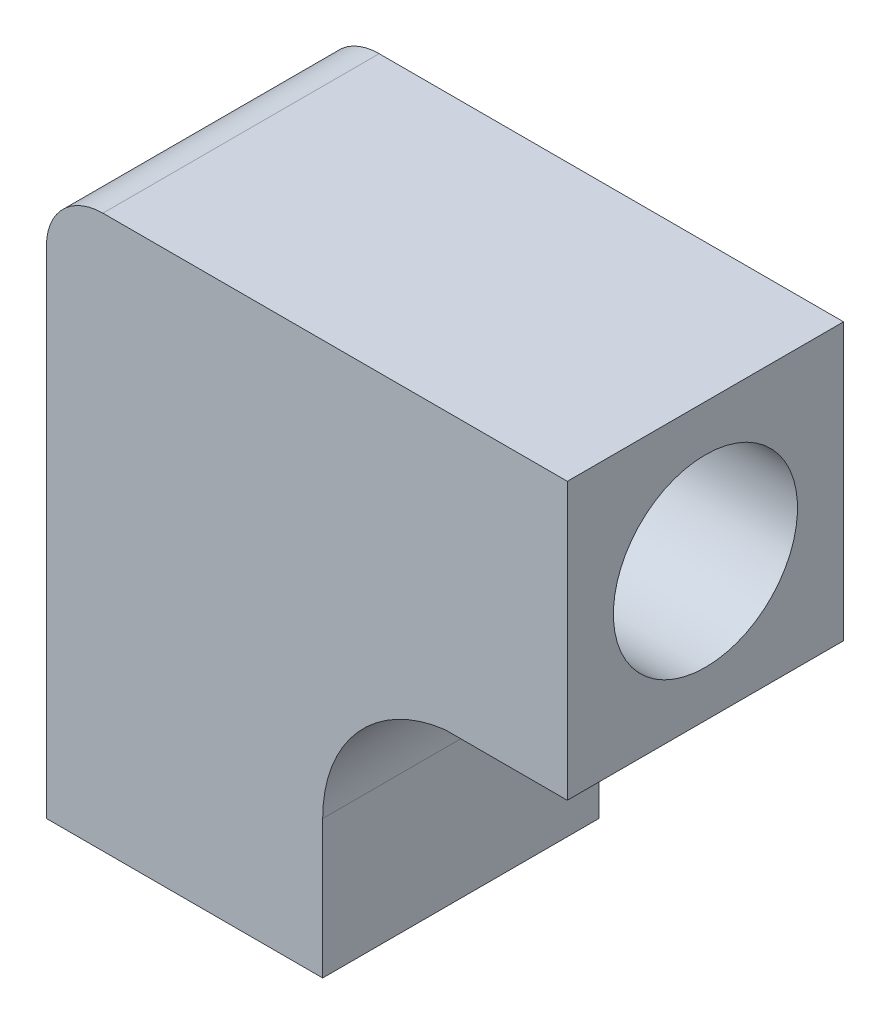
ISO-10303-21;
HEADER;
FILE_DESCRIPTION(('STEP AP214'),'2;1');
FILE_NAME('part.step','',(''),(''),'','','');
FILE_SCHEMA(('AUTOMOTIVE_DESIGN { 1 0 10303 214 1 1 1 1 }'));
ENDSEC;
DATA;
#1=APPLICATION_CONTEXT('core data for automotive mechanical design processes');
#2=APPLICATION_PROTOCOL_DEFINITION('international standard','automotive_design',2000,#1);
#3=PRODUCT_CONTEXT('',#1,'mechanical');
#4=PRODUCT('Part','Part','',(#3));
#5=PRODUCT_RELATED_PRODUCT_CATEGORY('part','',(#4));
#6=PRODUCT_DEFINITION_FORMATION('','',#4);
#7=PRODUCT_DEFINITION_CONTEXT('part definition',#1,'design');
#8=PRODUCT_DEFINITION('design','',#6,#7);
#9=PRODUCT_DEFINITION_SHAPE('','',#8);
#10=(LENGTH_UNIT() NAMED_UNIT(*) SI_UNIT(.MILLI.,.METRE.));
#11=(NAMED_UNIT(*) PLANE_ANGLE_UNIT() SI_UNIT($,.RADIAN.));
#12=(NAMED_UNIT(*) SI_UNIT($,.STERADIAN.) SOLID_ANGLE_UNIT());
#13=UNCERTAINTY_MEASURE_WITH_UNIT(LENGTH_MEASURE(1.E-05),#10,'distance_accuracy_value','');
#14=(GEOMETRIC_REPRESENTATION_CONTEXT(3) GLOBAL_UNCERTAINTY_ASSIGNED_CONTEXT((#13)) GLOBAL_UNIT_ASSIGNED_CONTEXT((#10,
#11,#12)) REPRESENTATION_CONTEXT('',''));
#15=CARTESIAN_POINT('',(0.,0.,0.));
#16=DIRECTION('',(0.,0.,1.));
#17=DIRECTION('',(1.,0.,0.));
#18=AXIS2_PLACEMENT_3D('',#15,#16,#17);
#19=CARTESIAN_POINT('',(0.,12.,6.));
#20=DIRECTION('',(0.,1.,0.));
#21=DIRECTION('',(0.,0.,1.));
#22=AXIS2_PLACEMENT_3D('',#19,#20,#21);
#23=PLANE('',#22);
#24=DIRECTION('',(1.,0.,0.));
#25=VECTOR('',#24,1.);
#26=CARTESIAN_POINT('',(0.,12.,0.));
#27=LINE('',#26,#25);
#28=CARTESIAN_POINT('',(-4.77317247755238,12.,0.));
#29=VERTEX_POINT('',#28);
#30=CARTESIAN_POINT('',(5.31378299120235,12.,0.));
#31=VERTEX_POINT('',#30);
#32=EDGE_CURVE('E130',#29,#31,#27,.T.);
#33=ORIENTED_EDGE('',*,*,#32,.F.);
#34=DIRECTION('',(0.,0.,-1.));
#35=VECTOR('',#34,1.);
#36=CARTESIAN_POINT('',(-4.77317247755238,12.,6.));
#37=LINE('',#36,#35);
#38=CARTESIAN_POINT('',(-4.77317247755238,12.,6.));
#39=VERTEX_POINT('',#38);
#40=EDGE_CURVE('E11',#39,#29,#37,.T.);
#41=ORIENTED_EDGE('',*,*,#40,.F.);
#42=DIRECTION('',(1.,0.,0.));
#43=VECTOR('',#42,1.);
#44=CARTESIAN_POINT('',(0.,12.,6.));
#45=LINE('',#44,#43);
#46=CARTESIAN_POINT('',(5.31378299120235,12.,6.));
#47=VERTEX_POINT('',#46);
#48=EDGE_CURVE('E151',#39,#47,#45,.T.);
#49=ORIENTED_EDGE('',*,*,#48,.T.);
#50=DIRECTION('',(0.,0.,-1.));
#51=VECTOR('',#50,1.);
#52=CARTESIAN_POINT('',(5.31378299120235,12.,6.));
#53=LINE('',#52,#51);
#54=EDGE_CURVE('E52',#47,#31,#53,.T.);
#55=ORIENTED_EDGE('',*,*,#54,.T.);
#56=EDGE_LOOP('',(#33,#41,#49,#55));
#57=FACE_BOUND('',#56,.T.);
#58=ADVANCED_FACE('F36',(#57),#23,.T.);
#59=CARTESIAN_POINT('',(-4.77317247755238,10.7731724775524,6.));
#60=DIRECTION('',(0.,0.,-1.));
#61=DIRECTION('',(-1.,0.,0.));
#62=AXIS2_PLACEMENT_3D('',#59,#60,#61);
#63=CYLINDRICAL_SURFACE('',#62,1.22682752244762);
#64=CARTESIAN_POINT('',(-4.77317247755238,10.7731724775524,0.));
#65=DIRECTION('',(0.,0.,1.));
#66=DIRECTION('',(1.,0.,0.));
#67=AXIS2_PLACEMENT_3D('',#64,#65,#66);
#68=CIRCLE('',#67,1.22682752244762);
#69=CARTESIAN_POINT('',(-6.,10.7731724775524,0.));
#70=VERTEX_POINT('',#69);
#71=EDGE_CURVE('E132',#29,#70,#68,.T.);
#72=ORIENTED_EDGE('',*,*,#71,.T.);
#73=DIRECTION('',(0.,0.,-1.));
#74=VECTOR('',#73,1.);
#75=CARTESIAN_POINT('',(-6.,10.7731724775524,6.));
#76=LINE('',#75,#74);
#77=CARTESIAN_POINT('',(-6.,10.7731724775524,6.));
#78=VERTEX_POINT('',#77);
#79=EDGE_CURVE('E44',#78,#70,#76,.T.);
#80=ORIENTED_EDGE('',*,*,#79,.F.);
#81=CARTESIAN_POINT('',(-4.77317247755238,10.7731724775524,6.));
#82=DIRECTION('',(0.,0.,1.));
#83=DIRECTION('',(1.,0.,0.));
#84=AXIS2_PLACEMENT_3D('',#81,#82,#83);
#85=CIRCLE('',#84,1.22682752244762);
#86=EDGE_CURVE('E176',#39,#78,#85,.T.);
#87=ORIENTED_EDGE('',*,*,#86,.F.);
#88=ORIENTED_EDGE('',*,*,#40,.T.);
#89=EDGE_LOOP('',(#72,#80,#87,#88));
#90=FACE_BOUND('',#89,.T.);
#91=ADVANCED_FACE('F167',(#90),#63,.T.);
#92=CARTESIAN_POINT('',(-6.,0.,6.));
#93=DIRECTION('',(-1.,0.,0.));
#94=DIRECTION('',(0.,0.,1.));
#95=AXIS2_PLACEMENT_3D('',#92,#93,#94);
#96=PLANE('',#95);
#97=DIRECTION('',(0.,1.,0.));
#98=VECTOR('',#97,1.);
#99=CARTESIAN_POINT('',(-6.,0.,0.));
#100=LINE('',#99,#98);
#101=CARTESIAN_POINT('',(-6.,0.,0.));
#102=VERTEX_POINT('',#101);
#103=EDGE_CURVE('E136',#102,#70,#100,.T.);
#104=ORIENTED_EDGE('',*,*,#103,.F.);
#105=DIRECTION('',(0.,0.,-1.));
#106=VECTOR('',#105,1.);
#107=CARTESIAN_POINT('',(-6.,0.,6.));
#108=LINE('',#107,#106);
#109=CARTESIAN_POINT('',(-6.,0.,6.));
#110=VERTEX_POINT('',#109);
#111=EDGE_CURVE('E157',#110,#102,#108,.T.);
#112=ORIENTED_EDGE('',*,*,#111,.F.);
#113=DIRECTION('',(0.,1.,0.));
#114=VECTOR('',#113,1.);
#115=CARTESIAN_POINT('',(-6.,0.,6.));
#116=LINE('',#115,#114);
#117=EDGE_CURVE('E164',#110,#78,#116,.T.);
#118=ORIENTED_EDGE('',*,*,#117,.T.);
#119=ORIENTED_EDGE('',*,*,#79,.T.);
#120=EDGE_LOOP('',(#104,#112,#118,#119));
#121=FACE_BOUND('',#120,.T.);
#122=ADVANCED_FACE('F162',(#121),#96,.T.);
#123=CARTESIAN_POINT('',(0.,0.,6.));
#124=DIRECTION('',(0.,-1.,0.));
#125=DIRECTION('',(1.,0.,0.));
#126=AXIS2_PLACEMENT_3D('',#123,#124,#125);
#127=PLANE('',#126);
#128=CARTESIAN_POINT('',(-3.,0.,3.));
#129=DIRECTION('',(0.,-1.,0.));
#130=DIRECTION('',(1.,0.,0.));
#131=AXIS2_PLACEMENT_3D('',#128,#129,#130);
#132=CIRCLE('',#131,2.);
#133=CARTESIAN_POINT('',(-1.,0.,3.));
#134=VERTEX_POINT('',#133);
#135=EDGE_CURVE('E297',#134,#134,#132,.T.);
#136=ORIENTED_EDGE('',*,*,#135,.F.);
#137=EDGE_LOOP('',(#136));
#138=FACE_BOUND('',#137,.T.);
#139=DIRECTION('',(-1.,0.,0.));
#140=VECTOR('',#139,1.);
#141=CARTESIAN_POINT('',(0.,0.,0.));
#142=LINE('',#141,#140);
#143=CARTESIAN_POINT('',(0.,0.,0.));
#144=VERTEX_POINT('',#143);
#145=EDGE_CURVE('E139',#144,#102,#142,.T.);
#146=ORIENTED_EDGE('',*,*,#145,.F.);
#147=DIRECTION('',(0.,0.,-1.));
#148=VECTOR('',#147,1.);
#149=CARTESIAN_POINT('',(0.,0.,6.));
#150=LINE('',#149,#148);
#151=CARTESIAN_POINT('',(0.,0.,6.));
#152=VERTEX_POINT('',#151);
#153=EDGE_CURVE('E155',#152,#144,#150,.T.);
#154=ORIENTED_EDGE('',*,*,#153,.F.);
#155=DIRECTION('',(-1.,0.,0.));
#156=VECTOR('',#155,1.);
#157=CARTESIAN_POINT('',(0.,0.,6.));
#158=LINE('',#157,#156);
#159=EDGE_CURVE('E175',#152,#110,#158,.T.);
#160=ORIENTED_EDGE('',*,*,#159,.T.);
#161=ORIENTED_EDGE('',*,*,#111,.T.);
#162=EDGE_LOOP('',(#146,#154,#160,#161));
#163=FACE_BOUND('',#162,.T.);
#164=ADVANCED_FACE('F173',(#138,#163),#127,.T.);
#165=CARTESIAN_POINT('',(0.,0.,6.));
#166=DIRECTION('',(1.,0.,0.));
#167=DIRECTION('',(0.,1.,0.));
#168=AXIS2_PLACEMENT_3D('',#165,#166,#167);
#169=PLANE('',#168);
#170=DIRECTION('',(0.,-1.,0.));
#171=VECTOR('',#170,1.);
#172=CARTESIAN_POINT('',(0.,0.,0.));
#173=LINE('',#172,#171);
#174=CARTESIAN_POINT('',(0.,3.,0.));
#175=VERTEX_POINT('',#174);
#176=EDGE_CURVE('E142',#175,#144,#173,.T.);
#177=ORIENTED_EDGE('',*,*,#176,.F.);
#178=DIRECTION('',(0.,0.,-1.));
#179=VECTOR('',#178,1.);
#180=CARTESIAN_POINT('',(0.,3.,6.));
#181=LINE('',#180,#179);
#182=CARTESIAN_POINT('',(0.,3.,6.));
#183=VERTEX_POINT('',#182);
#184=EDGE_CURVE('E122',#183,#175,#181,.T.);
#185=ORIENTED_EDGE('',*,*,#184,.F.);
#186=DIRECTION('',(0.,-1.,0.));
#187=VECTOR('',#186,1.);
#188=CARTESIAN_POINT('',(0.,0.,6.));
#189=LINE('',#188,#187);
#190=EDGE_CURVE('E112',#183,#152,#189,.T.);
#191=ORIENTED_EDGE('',*,*,#190,.T.);
#192=ORIENTED_EDGE('',*,*,#153,.T.);
#193=EDGE_LOOP('',(#177,#185,#191,#192));
#194=FACE_BOUND('',#193,.T.);
#195=ADVANCED_FACE('F182',(#194),#169,.T.);
#196=CARTESIAN_POINT('',(3.02215435707211,3.,6.));
#197=DIRECTION('',(0.,0.,-1.));
#198=DIRECTION('',(-1.,0.,0.));
#199=AXIS2_PLACEMENT_3D('',#196,#197,#198);
#200=CYLINDRICAL_SURFACE('',#199,3.02215435707211);
#201=CARTESIAN_POINT('',(3.02215435707211,3.,0.));
#202=DIRECTION('',(0.,0.,1.));
#203=DIRECTION('',(1.,0.,0.));
#204=AXIS2_PLACEMENT_3D('',#201,#202,#203);
#205=CIRCLE('',#204,3.02215435707211);
#206=CARTESIAN_POINT('',(2.65689149560117,6.,0.));
#207=VERTEX_POINT('',#206);
#208=EDGE_CURVE('E119',#175,#207,#205,.F.);
#209=ORIENTED_EDGE('',*,*,#208,.T.);
#210=DIRECTION('',(0.,0.,-1.));
#211=VECTOR('',#210,1.);
#212=CARTESIAN_POINT('',(2.65689149560117,6.,6.));
#213=LINE('',#212,#211);
#214=CARTESIAN_POINT('',(2.65689149560117,6.,6.));
#215=VERTEX_POINT('',#214);
#216=EDGE_CURVE('E116',#215,#207,#213,.T.);
#217=ORIENTED_EDGE('',*,*,#216,.F.);
#218=CARTESIAN_POINT('',(3.02215435707211,3.,6.));
#219=DIRECTION('',(0.,0.,1.));
#220=DIRECTION('',(1.,0.,0.));
#221=AXIS2_PLACEMENT_3D('',#218,#219,#220);
#222=CIRCLE('',#221,3.02215435707211);
#223=EDGE_CURVE('E103',#183,#215,#222,.F.);
#224=ORIENTED_EDGE('',*,*,#223,.F.);
#225=ORIENTED_EDGE('',*,*,#184,.T.);
#226=EDGE_LOOP('',(#209,#217,#224,#225));
#227=FACE_BOUND('',#226,.T.);
#228=ADVANCED_FACE('F117',(#227),#200,.F.);
#229=CARTESIAN_POINT('',(0.,6.,6.));
#230=DIRECTION('',(0.,-1.,0.));
#231=DIRECTION('',(0.,0.,-1.));
#232=AXIS2_PLACEMENT_3D('',#229,#230,#231);
#233=PLANE('',#232);
#234=DIRECTION('',(-1.,0.,0.));
#235=VECTOR('',#234,1.);
#236=CARTESIAN_POINT('',(0.,6.,0.));
#237=LINE('',#236,#235);
#238=CARTESIAN_POINT('',(5.31378299120235,6.,0.));
#239=VERTEX_POINT('',#238);
#240=EDGE_CURVE('E146',#239,#207,#237,.T.);
#241=ORIENTED_EDGE('',*,*,#240,.F.);
#242=DIRECTION('',(0.,0.,-1.));
#243=VECTOR('',#242,1.);
#244=CARTESIAN_POINT('',(5.31378299120235,6.,6.));
#245=LINE('',#244,#243);
#246=CARTESIAN_POINT('',(5.31378299120235,6.,6.));
#247=VERTEX_POINT('',#246);
#248=EDGE_CURVE('E77',#247,#239,#245,.T.);
#249=ORIENTED_EDGE('',*,*,#248,.F.);
#250=DIRECTION('',(-1.,0.,0.));
#251=VECTOR('',#250,1.);
#252=CARTESIAN_POINT('',(0.,6.,6.));
#253=LINE('',#252,#251);
#254=EDGE_CURVE('E109',#247,#215,#253,.T.);
#255=ORIENTED_EDGE('',*,*,#254,.T.);
#256=ORIENTED_EDGE('',*,*,#216,.T.);
#257=EDGE_LOOP('',(#241,#249,#255,#256));
#258=FACE_BOUND('',#257,.T.);
#259=ADVANCED_FACE('F124',(#258),#233,.T.);
#260=CARTESIAN_POINT('',(5.31378299120235,0.,6.));
#261=DIRECTION('',(1.,0.,0.));
#262=DIRECTION('',(0.,1.,0.));
#263=AXIS2_PLACEMENT_3D('',#260,#261,#262);
#264=PLANE('',#263);
#265=CARTESIAN_POINT('',(5.31378299120235,9.,3.));
#266=DIRECTION('',(1.,0.,0.));
#267=DIRECTION('',(0.,1.,0.));
#268=AXIS2_PLACEMENT_3D('',#265,#266,#267);
#269=CIRCLE('',#268,2.);
#270=CARTESIAN_POINT('',(5.31378299120235,11.,3.));
#271=VERTEX_POINT('',#270);
#272=EDGE_CURVE('E296',#271,#271,#269,.T.);
#273=ORIENTED_EDGE('',*,*,#272,.F.);
#274=EDGE_LOOP('',(#273));
#275=FACE_BOUND('',#274,.T.);
#276=DIRECTION('',(0.,-1.,0.));
#277=VECTOR('',#276,1.);
#278=CARTESIAN_POINT('',(5.31378299120235,0.,0.));
#279=LINE('',#278,#277);
#280=EDGE_CURVE('E148',#31,#239,#279,.T.);
#281=ORIENTED_EDGE('',*,*,#280,.F.);
#282=ORIENTED_EDGE('',*,*,#54,.F.);
#283=DIRECTION('',(0.,-1.,0.));
#284=VECTOR('',#283,1.);
#285=CARTESIAN_POINT('',(5.31378299120235,0.,6.));
#286=LINE('',#285,#284);
#287=EDGE_CURVE('E125',#47,#247,#286,.T.);
#288=ORIENTED_EDGE('',*,*,#287,.T.);
#289=ORIENTED_EDGE('',*,*,#248,.T.);
#290=EDGE_LOOP('',(#281,#282,#288,#289));
#291=FACE_BOUND('',#290,.T.);
#292=ADVANCED_FACE('F183',(#275,#291),#264,.T.);
#293=CARTESIAN_POINT('',(0.,0.,6.));
#294=DIRECTION('',(0.,0.,1.));
#295=DIRECTION('',(1.,0.,0.));
#296=AXIS2_PLACEMENT_3D('',#293,#294,#295);
#297=PLANE('',#296);
#298=ORIENTED_EDGE('',*,*,#48,.F.);
#299=ORIENTED_EDGE('',*,*,#86,.T.);
#300=ORIENTED_EDGE('',*,*,#117,.F.);
#301=ORIENTED_EDGE('',*,*,#159,.F.);
#302=ORIENTED_EDGE('',*,*,#190,.F.);
#303=ORIENTED_EDGE('',*,*,#223,.T.);
#304=ORIENTED_EDGE('',*,*,#254,.F.);
#305=ORIENTED_EDGE('',*,*,#287,.F.);
#306=EDGE_LOOP('',(#298,#299,#300,#301,#302,#303,#304,#305));
#307=FACE_BOUND('',#306,.T.);
#308=ADVANCED_FACE('F106',(#307),#297,.T.);
#309=CARTESIAN_POINT('',(0.,0.,0.));
#310=DIRECTION('',(0.,0.,1.));
#311=DIRECTION('',(1.,0.,0.));
#312=AXIS2_PLACEMENT_3D('',#309,#310,#311);
#313=PLANE('',#312);
#314=ORIENTED_EDGE('',*,*,#32,.T.);
#315=ORIENTED_EDGE('',*,*,#280,.T.);
#316=ORIENTED_EDGE('',*,*,#240,.T.);
#317=ORIENTED_EDGE('',*,*,#208,.F.);
#318=ORIENTED_EDGE('',*,*,#176,.T.);
#319=ORIENTED_EDGE('',*,*,#145,.T.);
#320=ORIENTED_EDGE('',*,*,#103,.T.);
#321=ORIENTED_EDGE('',*,*,#71,.F.);
#322=EDGE_LOOP('',(#314,#315,#316,#317,#318,#319,#320,#321));
#323=FACE_BOUND('',#322,.T.);
#324=ADVANCED_FACE('F169',(#323),#313,.F.);
#325=CARTESIAN_POINT('',(-0.686217008797654,9.,3.));
#326=DIRECTION('',(1.,0.,0.));
#327=DIRECTION('',(0.,1.,0.));
#328=AXIS2_PLACEMENT_3D('',#325,#326,#327);
#329=CYLINDRICAL_SURFACE('',#328,2.);
#330=CARTESIAN_POINT('',(-0.686217008797654,9.,3.));
#331=DIRECTION('',(1.,0.,0.));
#332=DIRECTION('',(0.,1.,0.));
#333=AXIS2_PLACEMENT_3D('',#330,#331,#332);
#334=CIRCLE('',#333,2.);
#335=CARTESIAN_POINT('',(-0.686217008797654,11.,3.));
#336=VERTEX_POINT('',#335);
#337=EDGE_CURVE('E133',#336,#336,#334,.T.);
#338=ORIENTED_EDGE('',*,*,#337,.F.);
#339=EDGE_LOOP('',(#338));
#340=FACE_BOUND('',#339,.T.);
#341=ORIENTED_EDGE('',*,*,#272,.T.);
#342=EDGE_LOOP('',(#341));
#343=FACE_BOUND('',#342,.T.);
#344=ADVANCED_FACE('F235',(#340,#343),#329,.F.);
#345=CARTESIAN_POINT('',(-0.686217008797651,0.,0.));
#346=DIRECTION('',(1.,0.,0.));
#347=DIRECTION('',(0.,1.,0.));
#348=AXIS2_PLACEMENT_3D('',#345,#346,#347);
#349=PLANE('',#348);
#350=ORIENTED_EDGE('',*,*,#337,.T.);
#351=EDGE_LOOP('',(#350));
#352=FACE_BOUND('',#351,.T.);
#353=ADVANCED_FACE('F247',(#352),#349,.T.);
#354=CARTESIAN_POINT('',(-3.,6.,3.));
#355=DIRECTION('',(0.,-1.,0.));
#356=DIRECTION('',(1.,0.,0.));
#357=AXIS2_PLACEMENT_3D('',#354,#355,#356);
#358=CYLINDRICAL_SURFACE('',#357,2.);
#359=CARTESIAN_POINT('',(-3.,6.,3.));
#360=DIRECTION('',(0.,-1.,0.));
#361=DIRECTION('',(1.,0.,0.));
#362=AXIS2_PLACEMENT_3D('',#359,#360,#361);
#363=CIRCLE('',#362,2.);
#364=CARTESIAN_POINT('',(-1.,6.,3.));
#365=VERTEX_POINT('',#364);
#366=EDGE_CURVE('E295',#365,#365,#363,.T.);
#367=ORIENTED_EDGE('',*,*,#366,.F.);
#368=EDGE_LOOP('',(#367));
#369=FACE_BOUND('',#368,.T.);
#370=ORIENTED_EDGE('',*,*,#135,.T.);
#371=EDGE_LOOP('',(#370));
#372=FACE_BOUND('',#371,.T.);
#373=ADVANCED_FACE('F258',(#369,#372),#358,.F.);
#374=CARTESIAN_POINT('',(0.,6.,0.));
#375=DIRECTION('',(0.,-1.,0.));
#376=DIRECTION('',(1.,0.,0.));
#377=AXIS2_PLACEMENT_3D('',#374,#375,#376);
#378=PLANE('',#377);
#379=ORIENTED_EDGE('',*,*,#366,.T.);
#380=EDGE_LOOP('',(#379));
#381=FACE_BOUND('',#380,.T.);
#382=ADVANCED_FACE('F276',(#381),#378,.T.);
#383=CLOSED_SHELL('',(#58,#91,#122,#164,#195,#228,#259,#292,#308,#324,#344,#353,#373,#382));
#384=MANIFOLD_SOLID_BREP('B2',#383);
#385=ADVANCED_BREP_SHAPE_REPRESENTATION('',(#18,#384),#14);
#386=SHAPE_DEFINITION_REPRESENTATION(#9,#385);
ENDSEC;
END-ISO-10303-21;
